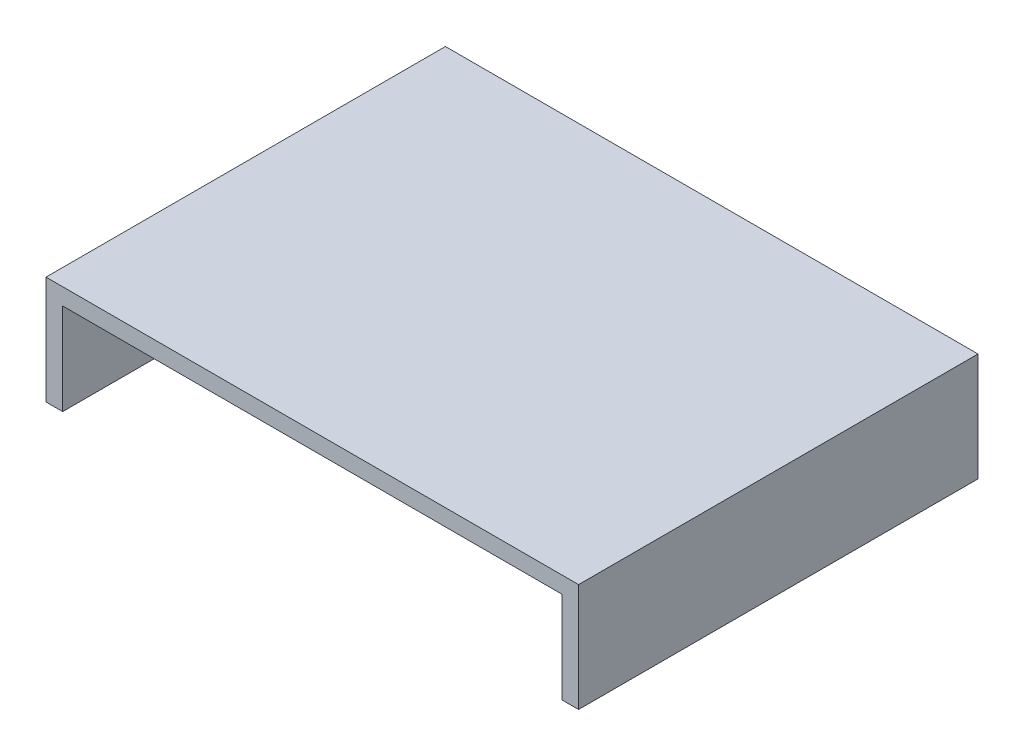
ISO-10303-21;
HEADER;
FILE_DESCRIPTION(('STEP AP214'),'2;1');
FILE_NAME('part.step','',(''),(''),'','','');
FILE_SCHEMA(('AUTOMOTIVE_DESIGN { 1 0 10303 214 1 1 1 1 }'));
ENDSEC;
DATA;
#1=APPLICATION_CONTEXT('core data for automotive mechanical design processes');
#2=APPLICATION_PROTOCOL_DEFINITION('international standard','automotive_design',2000,#1);
#3=PRODUCT_CONTEXT('',#1,'mechanical');
#4=PRODUCT('Part','Part','',(#3));
#5=PRODUCT_RELATED_PRODUCT_CATEGORY('part','',(#4));
#6=PRODUCT_DEFINITION_FORMATION('','',#4);
#7=PRODUCT_DEFINITION_CONTEXT('part definition',#1,'design');
#8=PRODUCT_DEFINITION('design','',#6,#7);
#9=PRODUCT_DEFINITION_SHAPE('','',#8);
#10=(LENGTH_UNIT() NAMED_UNIT(*) SI_UNIT(.MILLI.,.METRE.));
#11=(NAMED_UNIT(*) PLANE_ANGLE_UNIT() SI_UNIT($,.RADIAN.));
#12=(NAMED_UNIT(*) SI_UNIT($,.STERADIAN.) SOLID_ANGLE_UNIT());
#13=UNCERTAINTY_MEASURE_WITH_UNIT(LENGTH_MEASURE(1.E-05),#10,'distance_accuracy_value','');
#14=(GEOMETRIC_REPRESENTATION_CONTEXT(3) GLOBAL_UNCERTAINTY_ASSIGNED_CONTEXT((#13)) GLOBAL_UNIT_ASSIGNED_CONTEXT((#10,
#11,#12)) REPRESENTATION_CONTEXT('',''));
#15=CARTESIAN_POINT('',(0.,0.,0.));
#16=DIRECTION('',(0.,0.,1.));
#17=DIRECTION('',(1.,0.,0.));
#18=AXIS2_PLACEMENT_3D('',#15,#16,#17);
#19=CARTESIAN_POINT('',(-2.,0.,48.));
#20=DIRECTION('',(0.,1.,0.));
#21=DIRECTION('',(0.,0.,1.));
#22=AXIS2_PLACEMENT_3D('',#19,#20,#21);
#23=PLANE('',#22);
#24=DIRECTION('',(1.,0.,0.));
#25=VECTOR('',#24,1.);
#26=CARTESIAN_POINT('',(-2.,0.,0.));
#27=LINE('',#26,#25);
#28=CARTESIAN_POINT('',(-2.,0.,0.));
#29=VERTEX_POINT('',#28);
#30=CARTESIAN_POINT('',(0.,0.,0.));
#31=VERTEX_POINT('',#30);
#32=EDGE_CURVE('E140',#29,#31,#27,.T.);
#33=ORIENTED_EDGE('',*,*,#32,.T.);
#34=DIRECTION('',(0.,0.,-1.));
#35=VECTOR('',#34,1.);
#36=CARTESIAN_POINT('',(0.,0.,48.));
#37=LINE('',#36,#35);
#38=CARTESIAN_POINT('',(0.,0.,48.));
#39=VERTEX_POINT('',#38);
#40=EDGE_CURVE('E11',#39,#31,#37,.T.);
#41=ORIENTED_EDGE('',*,*,#40,.F.);
#42=DIRECTION('',(1.,0.,0.));
#43=VECTOR('',#42,1.);
#44=CARTESIAN_POINT('',(-2.,0.,48.));
#45=LINE('',#44,#43);
#46=CARTESIAN_POINT('',(-2.,0.,48.));
#47=VERTEX_POINT('',#46);
#48=EDGE_CURVE('E162',#47,#39,#45,.T.);
#49=ORIENTED_EDGE('',*,*,#48,.F.);
#50=DIRECTION('',(0.,0.,-1.));
#51=VECTOR('',#50,1.);
#52=CARTESIAN_POINT('',(-2.,0.,48.));
#53=LINE('',#52,#51);
#54=EDGE_CURVE('E136',#47,#29,#53,.T.);
#55=ORIENTED_EDGE('',*,*,#54,.T.);
#56=EDGE_LOOP('',(#33,#41,#49,#55));
#57=FACE_BOUND('',#56,.T.);
#58=ADVANCED_FACE('F39',(#57),#23,.F.);
#59=CARTESIAN_POINT('',(0.,0.,48.));
#60=DIRECTION('',(-1.,0.,0.));
#61=DIRECTION('',(0.,0.,1.));
#62=AXIS2_PLACEMENT_3D('',#59,#60,#61);
#63=PLANE('',#62);
#64=DIRECTION('',(0.,1.,0.));
#65=VECTOR('',#64,1.);
#66=CARTESIAN_POINT('',(0.,0.,0.));
#67=LINE('',#66,#65);
#68=CARTESIAN_POINT('',(0.,11.,0.));
#69=VERTEX_POINT('',#68);
#70=EDGE_CURVE('E144',#31,#69,#67,.T.);
#71=ORIENTED_EDGE('',*,*,#70,.T.);
#72=DIRECTION('',(0.,0.,-1.));
#73=VECTOR('',#72,1.);
#74=CARTESIAN_POINT('',(0.,11.,48.));
#75=LINE('',#74,#73);
#76=CARTESIAN_POINT('',(0.,11.,48.));
#77=VERTEX_POINT('',#76);
#78=EDGE_CURVE('E48',#77,#69,#75,.T.);
#79=ORIENTED_EDGE('',*,*,#78,.F.);
#80=DIRECTION('',(0.,1.,0.));
#81=VECTOR('',#80,1.);
#82=CARTESIAN_POINT('',(0.,0.,48.));
#83=LINE('',#82,#81);
#84=EDGE_CURVE('E99',#39,#77,#83,.T.);
#85=ORIENTED_EDGE('',*,*,#84,.F.);
#86=ORIENTED_EDGE('',*,*,#40,.T.);
#87=EDGE_LOOP('',(#71,#79,#85,#86));
#88=FACE_BOUND('',#87,.T.);
#89=ADVANCED_FACE('F208',(#88),#63,.F.);
#90=CARTESIAN_POINT('',(0.,11.,48.));
#91=DIRECTION('',(0.,1.,0.));
#92=DIRECTION('',(0.,0.,1.));
#93=AXIS2_PLACEMENT_3D('',#90,#91,#92);
#94=PLANE('',#93);
#95=DIRECTION('',(1.,0.,0.));
#96=VECTOR('',#95,1.);
#97=CARTESIAN_POINT('',(0.,11.,0.));
#98=LINE('',#97,#96);
#99=CARTESIAN_POINT('',(60.,11.,0.));
#100=VERTEX_POINT('',#99);
#101=EDGE_CURVE('E147',#69,#100,#98,.T.);
#102=ORIENTED_EDGE('',*,*,#101,.T.);
#103=DIRECTION('',(0.,0.,-1.));
#104=VECTOR('',#103,1.);
#105=CARTESIAN_POINT('',(60.,11.,48.));
#106=LINE('',#105,#104);
#107=CARTESIAN_POINT('',(60.,11.,48.));
#108=VERTEX_POINT('',#107);
#109=EDGE_CURVE('E173',#108,#100,#106,.T.);
#110=ORIENTED_EDGE('',*,*,#109,.F.);
#111=DIRECTION('',(1.,0.,0.));
#112=VECTOR('',#111,1.);
#113=CARTESIAN_POINT('',(0.,11.,48.));
#114=LINE('',#113,#112);
#115=EDGE_CURVE('E183',#77,#108,#114,.T.);
#116=ORIENTED_EDGE('',*,*,#115,.F.);
#117=ORIENTED_EDGE('',*,*,#78,.T.);
#118=EDGE_LOOP('',(#102,#110,#116,#117));
#119=FACE_BOUND('',#118,.T.);
#120=ADVANCED_FACE('F181',(#119),#94,.F.);
#121=CARTESIAN_POINT('',(60.,11.,48.));
#122=DIRECTION('',(1.,0.,0.));
#123=DIRECTION('',(0.,0.,-1.));
#124=AXIS2_PLACEMENT_3D('',#121,#122,#123);
#125=PLANE('',#124);
#126=DIRECTION('',(0.,-1.,0.));
#127=VECTOR('',#126,1.);
#128=CARTESIAN_POINT('',(60.,11.,0.));
#129=LINE('',#128,#127);
#130=CARTESIAN_POINT('',(60.,0.,0.));
#131=VERTEX_POINT('',#130);
#132=EDGE_CURVE('E150',#100,#131,#129,.T.);
#133=ORIENTED_EDGE('',*,*,#132,.T.);
#134=DIRECTION('',(0.,0.,-1.));
#135=VECTOR('',#134,1.);
#136=CARTESIAN_POINT('',(60.,0.,48.));
#137=LINE('',#136,#135);
#138=CARTESIAN_POINT('',(60.,0.,48.));
#139=VERTEX_POINT('',#138);
#140=EDGE_CURVE('E169',#139,#131,#137,.T.);
#141=ORIENTED_EDGE('',*,*,#140,.F.);
#142=DIRECTION('',(0.,-1.,0.));
#143=VECTOR('',#142,1.);
#144=CARTESIAN_POINT('',(60.,11.,48.));
#145=LINE('',#144,#143);
#146=EDGE_CURVE('E196',#108,#139,#145,.T.);
#147=ORIENTED_EDGE('',*,*,#146,.F.);
#148=ORIENTED_EDGE('',*,*,#109,.T.);
#149=EDGE_LOOP('',(#133,#141,#147,#148));
#150=FACE_BOUND('',#149,.T.);
#151=ADVANCED_FACE('F191',(#150),#125,.F.);
#152=CARTESIAN_POINT('',(60.,0.,48.));
#153=DIRECTION('',(0.,1.,0.));
#154=DIRECTION('',(0.,0.,1.));
#155=AXIS2_PLACEMENT_3D('',#152,#153,#154);
#156=PLANE('',#155);
#157=DIRECTION('',(1.,0.,0.));
#158=VECTOR('',#157,1.);
#159=CARTESIAN_POINT('',(60.,0.,0.));
#160=LINE('',#159,#158);
#161=CARTESIAN_POINT('',(62.,0.,0.));
#162=VERTEX_POINT('',#161);
#163=EDGE_CURVE('E153',#131,#162,#160,.T.);
#164=ORIENTED_EDGE('',*,*,#163,.T.);
#165=DIRECTION('',(0.,0.,-1.));
#166=VECTOR('',#165,1.);
#167=CARTESIAN_POINT('',(62.,0.,48.));
#168=LINE('',#167,#166);
#169=CARTESIAN_POINT('',(62.,0.,48.));
#170=VERTEX_POINT('',#169);
#171=EDGE_CURVE('E129',#170,#162,#168,.T.);
#172=ORIENTED_EDGE('',*,*,#171,.F.);
#173=DIRECTION('',(1.,0.,0.));
#174=VECTOR('',#173,1.);
#175=CARTESIAN_POINT('',(60.,0.,48.));
#176=LINE('',#175,#174);
#177=EDGE_CURVE('E118',#139,#170,#176,.T.);
#178=ORIENTED_EDGE('',*,*,#177,.F.);
#179=ORIENTED_EDGE('',*,*,#140,.T.);
#180=EDGE_LOOP('',(#164,#172,#178,#179));
#181=FACE_BOUND('',#180,.T.);
#182=ADVANCED_FACE('F194',(#181),#156,.F.);
#183=CARTESIAN_POINT('',(62.,0.,48.));
#184=DIRECTION('',(-1.,0.,0.));
#185=DIRECTION('',(0.,0.,1.));
#186=AXIS2_PLACEMENT_3D('',#183,#184,#185);
#187=PLANE('',#186);
#188=DIRECTION('',(0.,1.,0.));
#189=VECTOR('',#188,1.);
#190=CARTESIAN_POINT('',(62.,0.,0.));
#191=LINE('',#190,#189);
#192=CARTESIAN_POINT('',(62.,13.,0.));
#193=VERTEX_POINT('',#192);
#194=EDGE_CURVE('E127',#162,#193,#191,.T.);
#195=ORIENTED_EDGE('',*,*,#194,.T.);
#196=DIRECTION('',(0.,0.,-1.));
#197=VECTOR('',#196,1.);
#198=CARTESIAN_POINT('',(62.,13.,48.));
#199=LINE('',#198,#197);
#200=CARTESIAN_POINT('',(62.,13.,48.));
#201=VERTEX_POINT('',#200);
#202=EDGE_CURVE('E124',#201,#193,#199,.T.);
#203=ORIENTED_EDGE('',*,*,#202,.F.);
#204=DIRECTION('',(0.,1.,0.));
#205=VECTOR('',#204,1.);
#206=CARTESIAN_POINT('',(62.,0.,48.));
#207=LINE('',#206,#205);
#208=EDGE_CURVE('E112',#170,#201,#207,.T.);
#209=ORIENTED_EDGE('',*,*,#208,.F.);
#210=ORIENTED_EDGE('',*,*,#171,.T.);
#211=EDGE_LOOP('',(#195,#203,#209,#210));
#212=FACE_BOUND('',#211,.T.);
#213=ADVANCED_FACE('F125',(#212),#187,.F.);
#214=CARTESIAN_POINT('',(62.,13.,48.));
#215=DIRECTION('',(0.,-1.,0.));
#216=DIRECTION('',(1.,0.,0.));
#217=AXIS2_PLACEMENT_3D('',#214,#215,#216);
#218=PLANE('',#217);
#219=DIRECTION('',(-1.,0.,0.));
#220=VECTOR('',#219,1.);
#221=CARTESIAN_POINT('',(62.,13.,0.));
#222=LINE('',#221,#220);
#223=CARTESIAN_POINT('',(-2.,13.,0.));
#224=VERTEX_POINT('',#223);
#225=EDGE_CURVE('E85',#193,#224,#222,.T.);
#226=ORIENTED_EDGE('',*,*,#225,.T.);
#227=DIRECTION('',(0.,0.,-1.));
#228=VECTOR('',#227,1.);
#229=CARTESIAN_POINT('',(-2.,13.,48.));
#230=LINE('',#229,#228);
#231=CARTESIAN_POINT('',(-2.,13.,48.));
#232=VERTEX_POINT('',#231);
#233=EDGE_CURVE('E130',#232,#224,#230,.T.);
#234=ORIENTED_EDGE('',*,*,#233,.F.);
#235=DIRECTION('',(-1.,0.,0.));
#236=VECTOR('',#235,1.);
#237=CARTESIAN_POINT('',(62.,13.,48.));
#238=LINE('',#237,#236);
#239=EDGE_CURVE('E116',#201,#232,#238,.T.);
#240=ORIENTED_EDGE('',*,*,#239,.F.);
#241=ORIENTED_EDGE('',*,*,#202,.T.);
#242=EDGE_LOOP('',(#226,#234,#240,#241));
#243=FACE_BOUND('',#242,.T.);
#244=ADVANCED_FACE('F132',(#243),#218,.F.);
#245=CARTESIAN_POINT('',(-2.,13.,48.));
#246=DIRECTION('',(1.,0.,0.));
#247=DIRECTION('',(0.,1.,0.));
#248=AXIS2_PLACEMENT_3D('',#245,#246,#247);
#249=PLANE('',#248);
#250=DIRECTION('',(0.,-1.,0.));
#251=VECTOR('',#250,1.);
#252=CARTESIAN_POINT('',(-2.,13.,0.));
#253=LINE('',#252,#251);
#254=EDGE_CURVE('E91',#224,#29,#253,.T.);
#255=ORIENTED_EDGE('',*,*,#254,.T.);
#256=ORIENTED_EDGE('',*,*,#54,.F.);
#257=DIRECTION('',(0.,-1.,0.));
#258=VECTOR('',#257,1.);
#259=CARTESIAN_POINT('',(-2.,13.,48.));
#260=LINE('',#259,#258);
#261=EDGE_CURVE('E56',#232,#47,#260,.T.);
#262=ORIENTED_EDGE('',*,*,#261,.F.);
#263=ORIENTED_EDGE('',*,*,#233,.T.);
#264=EDGE_LOOP('',(#255,#256,#262,#263));
#265=FACE_BOUND('',#264,.T.);
#266=ADVANCED_FACE('F224',(#265),#249,.F.);
#267=CARTESIAN_POINT('',(0.,0.,48.));
#268=DIRECTION('',(0.,0.,1.));
#269=DIRECTION('',(1.,0.,0.));
#270=AXIS2_PLACEMENT_3D('',#267,#268,#269);
#271=PLANE('',#270);
#272=ORIENTED_EDGE('',*,*,#48,.T.);
#273=ORIENTED_EDGE('',*,*,#84,.T.);
#274=ORIENTED_EDGE('',*,*,#115,.T.);
#275=ORIENTED_EDGE('',*,*,#146,.T.);
#276=ORIENTED_EDGE('',*,*,#177,.T.);
#277=ORIENTED_EDGE('',*,*,#208,.T.);
#278=ORIENTED_EDGE('',*,*,#239,.T.);
#279=ORIENTED_EDGE('',*,*,#261,.T.);
#280=EDGE_LOOP('',(#272,#273,#274,#275,#276,#277,#278,#279));
#281=FACE_BOUND('',#280,.T.);
#282=ADVANCED_FACE('F114',(#281),#271,.T.);
#283=CARTESIAN_POINT('',(0.,0.,0.));
#284=DIRECTION('',(0.,0.,1.));
#285=DIRECTION('',(1.,0.,0.));
#286=AXIS2_PLACEMENT_3D('',#283,#284,#285);
#287=PLANE('',#286);
#288=ORIENTED_EDGE('',*,*,#32,.F.);
#289=ORIENTED_EDGE('',*,*,#254,.F.);
#290=ORIENTED_EDGE('',*,*,#225,.F.);
#291=ORIENTED_EDGE('',*,*,#194,.F.);
#292=ORIENTED_EDGE('',*,*,#163,.F.);
#293=ORIENTED_EDGE('',*,*,#132,.F.);
#294=ORIENTED_EDGE('',*,*,#101,.F.);
#295=ORIENTED_EDGE('',*,*,#70,.F.);
#296=EDGE_LOOP('',(#288,#289,#290,#291,#292,#293,#294,#295));
#297=FACE_BOUND('',#296,.T.);
#298=ADVANCED_FACE('F187',(#297),#287,.F.);
#299=CLOSED_SHELL('',(#58,#89,#120,#151,#182,#213,#244,#266,#282,#298));
#300=MANIFOLD_SOLID_BREP('B2',#299);
#301=ADVANCED_BREP_SHAPE_REPRESENTATION('',(#18,#300),#14);
#302=SHAPE_DEFINITION_REPRESENTATION(#9,#301);
ENDSEC;
END-ISO-10303-21;
